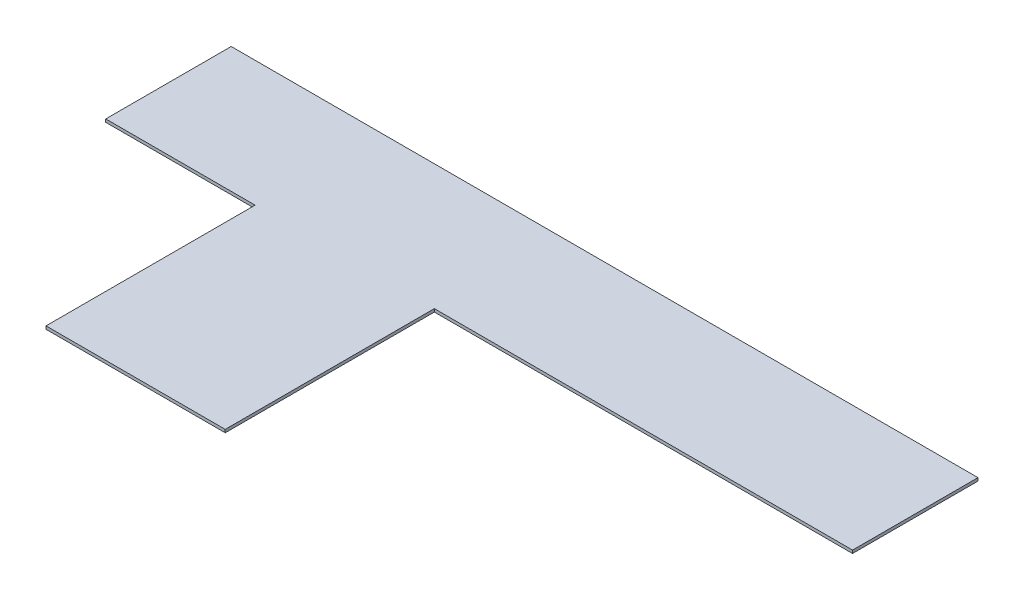
ISO-10303-21;
HEADER;
FILE_DESCRIPTION(('STEP AP214'),'2;1');
FILE_NAME('part.step','',(''),(''),'','','');
FILE_SCHEMA(('AUTOMOTIVE_DESIGN { 1 0 10303 214 1 1 1 1 }'));
ENDSEC;
DATA;
#1=APPLICATION_CONTEXT('core data for automotive mechanical design processes');
#2=APPLICATION_PROTOCOL_DEFINITION('international standard','automotive_design',2000,#1);
#3=PRODUCT_CONTEXT('',#1,'mechanical');
#4=PRODUCT('Part','Part','',(#3));
#5=PRODUCT_RELATED_PRODUCT_CATEGORY('part','',(#4));
#6=PRODUCT_DEFINITION_FORMATION('','',#4);
#7=PRODUCT_DEFINITION_CONTEXT('part definition',#1,'design');
#8=PRODUCT_DEFINITION('design','',#6,#7);
#9=PRODUCT_DEFINITION_SHAPE('','',#8);
#10=(LENGTH_UNIT() NAMED_UNIT(*) SI_UNIT(.MILLI.,.METRE.));
#11=(NAMED_UNIT(*) PLANE_ANGLE_UNIT() SI_UNIT($,.RADIAN.));
#12=(NAMED_UNIT(*) SI_UNIT($,.STERADIAN.) SOLID_ANGLE_UNIT());
#13=UNCERTAINTY_MEASURE_WITH_UNIT(LENGTH_MEASURE(1.E-05),#10,'distance_accuracy_value','');
#14=(GEOMETRIC_REPRESENTATION_CONTEXT(3) GLOBAL_UNCERTAINTY_ASSIGNED_CONTEXT((#13)) GLOBAL_UNIT_ASSIGNED_CONTEXT((#10,
#11,#12)) REPRESENTATION_CONTEXT('',''));
#15=CARTESIAN_POINT('',(0.,0.,0.));
#16=DIRECTION('',(0.,0.,1.));
#17=DIRECTION('',(1.,0.,0.));
#18=AXIS2_PLACEMENT_3D('',#15,#16,#17);
#19=CARTESIAN_POINT('',(6088.0829015544,50.,0.));
#20=DIRECTION('',(1.,0.,0.));
#21=DIRECTION('',(0.,0.,-1.));
#22=AXIS2_PLACEMENT_3D('',#19,#20,#21);
#23=PLANE('',#22);
#24=DIRECTION('',(0.,0.,1.));
#25=VECTOR('',#24,1.);
#26=CARTESIAN_POINT('',(6088.0829015544,0.,0.));
#27=LINE('',#26,#25);
#28=CARTESIAN_POINT('',(6088.0829015544,0.,-2389.89637305699));
#29=VERTEX_POINT('',#28);
#30=CARTESIAN_POINT('',(6088.0829015544,0.,-289.896373056994));
#31=VERTEX_POINT('',#30);
#32=EDGE_CURVE('E230',#29,#31,#27,.T.);
#33=ORIENTED_EDGE('',*,*,#32,.F.);
#34=DIRECTION('',(0.,-1.,0.));
#35=VECTOR('',#34,1.);
#36=CARTESIAN_POINT('',(6088.0829015544,50.,-2389.89637305699));
#37=LINE('',#36,#35);
#38=CARTESIAN_POINT('',(6088.0829015544,50.,-2389.89637305699));
#39=VERTEX_POINT('',#38);
#40=EDGE_CURVE('E11',#39,#29,#37,.T.);
#41=ORIENTED_EDGE('',*,*,#40,.F.);
#42=DIRECTION('',(0.,0.,1.));
#43=VECTOR('',#42,1.);
#44=CARTESIAN_POINT('',(6088.0829015544,50.,0.));
#45=LINE('',#44,#43);
#46=CARTESIAN_POINT('',(6088.0829015544,50.,-289.896373056994));
#47=VERTEX_POINT('',#46);
#48=EDGE_CURVE('E327',#39,#47,#45,.T.);
#49=ORIENTED_EDGE('',*,*,#48,.T.);
#50=DIRECTION('',(0.,-1.,0.));
#51=VECTOR('',#50,1.);
#52=CARTESIAN_POINT('',(6088.0829015544,50.,-289.896373056994));
#53=LINE('',#52,#51);
#54=EDGE_CURVE('E363',#47,#31,#53,.T.);
#55=ORIENTED_EDGE('',*,*,#54,.T.);
#56=EDGE_LOOP('',(#33,#41,#49,#55));
#57=FACE_BOUND('',#56,.T.);
#58=ADVANCED_FACE('F35',(#57),#23,.T.);
#59=CARTESIAN_POINT('',(0.,50.,-2389.89637305699));
#60=DIRECTION('',(0.,0.,-1.));
#61=DIRECTION('',(-1.,0.,0.));
#62=AXIS2_PLACEMENT_3D('',#59,#60,#61);
#63=PLANE('',#62);
#64=DIRECTION('',(1.,0.,0.));
#65=VECTOR('',#64,1.);
#66=CARTESIAN_POINT('',(0.,0.,-2389.89637305699));
#67=LINE('',#66,#65);
#68=CARTESIAN_POINT('',(-6411.9170984456,0.,-2389.89637305699));
#69=VERTEX_POINT('',#68);
#70=EDGE_CURVE('E348',#69,#29,#67,.T.);
#71=ORIENTED_EDGE('',*,*,#70,.F.);
#72=DIRECTION('',(0.,-1.,0.));
#73=VECTOR('',#72,1.);
#74=CARTESIAN_POINT('',(-6411.9170984456,50.,-2389.89637305699));
#75=LINE('',#74,#73);
#76=CARTESIAN_POINT('',(-6411.9170984456,50.,-2389.89637305699));
#77=VERTEX_POINT('',#76);
#78=EDGE_CURVE('E42',#77,#69,#75,.T.);
#79=ORIENTED_EDGE('',*,*,#78,.F.);
#80=DIRECTION('',(1.,0.,0.));
#81=VECTOR('',#80,1.);
#82=CARTESIAN_POINT('',(0.,50.,-2389.89637305699));
#83=LINE('',#82,#81);
#84=EDGE_CURVE('E330',#77,#39,#83,.T.);
#85=ORIENTED_EDGE('',*,*,#84,.T.);
#86=ORIENTED_EDGE('',*,*,#40,.T.);
#87=EDGE_LOOP('',(#71,#79,#85,#86));
#88=FACE_BOUND('',#87,.T.);
#89=ADVANCED_FACE('F389',(#88),#63,.T.);
#90=CARTESIAN_POINT('',(-6411.9170984456,50.,-2.71186971225982E-12));
#91=DIRECTION('',(1.,0.,0.));
#92=DIRECTION('',(0.,0.,-1.));
#93=AXIS2_PLACEMENT_3D('',#90,#91,#92);
#94=PLANE('',#93);
#95=DIRECTION('',(0.,0.,1.));
#96=VECTOR('',#95,1.);
#97=CARTESIAN_POINT('',(-6411.9170984456,0.,-2.71186971225982E-12));
#98=LINE('',#97,#96);
#99=CARTESIAN_POINT('',(-6411.9170984456,0.,-289.896373056994));
#100=VERTEX_POINT('',#99);
#101=EDGE_CURVE('E351',#69,#100,#98,.T.);
#102=ORIENTED_EDGE('',*,*,#101,.T.);
#103=DIRECTION('',(0.,-1.,0.));
#104=VECTOR('',#103,1.);
#105=CARTESIAN_POINT('',(-6411.9170984456,50.,-289.896373056994));
#106=LINE('',#105,#104);
#107=CARTESIAN_POINT('',(-6411.9170984456,50.,-289.896373056994));
#108=VERTEX_POINT('',#107);
#109=EDGE_CURVE('E375',#108,#100,#106,.T.);
#110=ORIENTED_EDGE('',*,*,#109,.F.);
#111=DIRECTION('',(0.,0.,1.));
#112=VECTOR('',#111,1.);
#113=CARTESIAN_POINT('',(-6411.9170984456,50.,-2.71186971225982E-12));
#114=LINE('',#113,#112);
#115=EDGE_CURVE('E334',#77,#108,#114,.T.);
#116=ORIENTED_EDGE('',*,*,#115,.F.);
#117=ORIENTED_EDGE('',*,*,#78,.T.);
#118=EDGE_LOOP('',(#102,#110,#116,#117));
#119=FACE_BOUND('',#118,.T.);
#120=ADVANCED_FACE('F380',(#119),#94,.F.);
#121=CARTESIAN_POINT('',(0.,50.,-289.896373056994));
#122=DIRECTION('',(0.,0.,-1.));
#123=DIRECTION('',(-1.,0.,0.));
#124=AXIS2_PLACEMENT_3D('',#121,#122,#123);
#125=PLANE('',#124);
#126=DIRECTION('',(1.,0.,0.));
#127=VECTOR('',#126,1.);
#128=CARTESIAN_POINT('',(0.,0.,-289.896373056994));
#129=LINE('',#128,#127);
#130=CARTESIAN_POINT('',(-3911.9170984456,0.,-289.896373056994));
#131=VERTEX_POINT('',#130);
#132=EDGE_CURVE('E353',#100,#131,#129,.T.);
#133=ORIENTED_EDGE('',*,*,#132,.T.);
#134=DIRECTION('',(0.,-1.,0.));
#135=VECTOR('',#134,1.);
#136=CARTESIAN_POINT('',(-3911.9170984456,50.,-289.896373056994));
#137=LINE('',#136,#135);
#138=CARTESIAN_POINT('',(-3911.9170984456,50.,-289.896373056994));
#139=VERTEX_POINT('',#138);
#140=EDGE_CURVE('E372',#139,#131,#137,.T.);
#141=ORIENTED_EDGE('',*,*,#140,.F.);
#142=DIRECTION('',(1.,0.,0.));
#143=VECTOR('',#142,1.);
#144=CARTESIAN_POINT('',(0.,50.,-289.896373056994));
#145=LINE('',#144,#143);
#146=EDGE_CURVE('E336',#108,#139,#145,.T.);
#147=ORIENTED_EDGE('',*,*,#146,.F.);
#148=ORIENTED_EDGE('',*,*,#109,.T.);
#149=EDGE_LOOP('',(#133,#141,#147,#148));
#150=FACE_BOUND('',#149,.T.);
#151=ADVANCED_FACE('F414',(#150),#125,.F.);
#152=CARTESIAN_POINT('',(-3911.9170984456,50.,9.92708670427231E-13));
#153=DIRECTION('',(1.,0.,0.));
#154=DIRECTION('',(0.,0.,-1.));
#155=AXIS2_PLACEMENT_3D('',#152,#153,#154);
#156=PLANE('',#155);
#157=DIRECTION('',(0.,0.,1.));
#158=VECTOR('',#157,1.);
#159=CARTESIAN_POINT('',(-3911.9170984456,0.,9.92708670427231E-13));
#160=LINE('',#159,#158);
#161=CARTESIAN_POINT('',(-3911.91709844559,0.,3210.10362694301));
#162=VERTEX_POINT('',#161);
#163=EDGE_CURVE('E355',#131,#162,#160,.T.);
#164=ORIENTED_EDGE('',*,*,#163,.T.);
#165=DIRECTION('',(0.,-1.,0.));
#166=VECTOR('',#165,1.);
#167=CARTESIAN_POINT('',(-3911.91709844559,50.,3210.10362694301));
#168=LINE('',#167,#166);
#169=CARTESIAN_POINT('',(-3911.91709844559,50.,3210.10362694301));
#170=VERTEX_POINT('',#169);
#171=EDGE_CURVE('E369',#170,#162,#168,.T.);
#172=ORIENTED_EDGE('',*,*,#171,.F.);
#173=DIRECTION('',(0.,0.,1.));
#174=VECTOR('',#173,1.);
#175=CARTESIAN_POINT('',(-3911.9170984456,50.,9.92708670427231E-13));
#176=LINE('',#175,#174);
#177=EDGE_CURVE('E338',#139,#170,#176,.T.);
#178=ORIENTED_EDGE('',*,*,#177,.F.);
#179=ORIENTED_EDGE('',*,*,#140,.T.);
#180=EDGE_LOOP('',(#164,#172,#178,#179));
#181=FACE_BOUND('',#180,.T.);
#182=ADVANCED_FACE('F409',(#181),#156,.F.);
#183=CARTESIAN_POINT('',(0.,50.,3210.10362694301));
#184=DIRECTION('',(0.,0.,-1.));
#185=DIRECTION('',(-1.,0.,0.));
#186=AXIS2_PLACEMENT_3D('',#183,#184,#185);
#187=PLANE('',#186);
#188=DIRECTION('',(1.,0.,0.));
#189=VECTOR('',#188,1.);
#190=CARTESIAN_POINT('',(0.,0.,3210.10362694301));
#191=LINE('',#190,#189);
#192=CARTESIAN_POINT('',(-911.917098445595,0.,3210.10362694301));
#193=VERTEX_POINT('',#192);
#194=EDGE_CURVE('E357',#162,#193,#191,.T.);
#195=ORIENTED_EDGE('',*,*,#194,.T.);
#196=DIRECTION('',(0.,-1.,0.));
#197=VECTOR('',#196,1.);
#198=CARTESIAN_POINT('',(-911.917098445595,50.,3210.10362694301));
#199=LINE('',#198,#197);
#200=CARTESIAN_POINT('',(-911.917098445595,50.,3210.10362694301));
#201=VERTEX_POINT('',#200);
#202=EDGE_CURVE('E367',#201,#193,#199,.T.);
#203=ORIENTED_EDGE('',*,*,#202,.F.);
#204=DIRECTION('',(1.,0.,0.));
#205=VECTOR('',#204,1.);
#206=CARTESIAN_POINT('',(0.,50.,3210.10362694301));
#207=LINE('',#206,#205);
#208=EDGE_CURVE('E341',#170,#201,#207,.T.);
#209=ORIENTED_EDGE('',*,*,#208,.F.);
#210=ORIENTED_EDGE('',*,*,#171,.T.);
#211=EDGE_LOOP('',(#195,#203,#209,#210));
#212=FACE_BOUND('',#211,.T.);
#213=ADVANCED_FACE('F406',(#212),#187,.F.);
#214=CARTESIAN_POINT('',(-911.917098445595,50.,0.));
#215=DIRECTION('',(1.,0.,0.));
#216=DIRECTION('',(0.,0.,-1.));
#217=AXIS2_PLACEMENT_3D('',#214,#215,#216);
#218=PLANE('',#217);
#219=DIRECTION('',(0.,0.,1.));
#220=VECTOR('',#219,1.);
#221=CARTESIAN_POINT('',(-911.917098445595,0.,0.));
#222=LINE('',#221,#220);
#223=CARTESIAN_POINT('',(-911.917098445595,0.,-289.896373056994));
#224=VERTEX_POINT('',#223);
#225=EDGE_CURVE('E360',#224,#193,#222,.T.);
#226=ORIENTED_EDGE('',*,*,#225,.F.);
#227=DIRECTION('',(0.,-1.,0.));
#228=VECTOR('',#227,1.);
#229=CARTESIAN_POINT('',(-911.917098445595,50.,-289.896373056994));
#230=LINE('',#229,#228);
#231=CARTESIAN_POINT('',(-911.917098445595,50.,-289.896373056994));
#232=VERTEX_POINT('',#231);
#233=EDGE_CURVE('E365',#232,#224,#230,.T.);
#234=ORIENTED_EDGE('',*,*,#233,.F.);
#235=DIRECTION('',(0.,0.,1.));
#236=VECTOR('',#235,1.);
#237=CARTESIAN_POINT('',(-911.917098445595,50.,0.));
#238=LINE('',#237,#236);
#239=EDGE_CURVE('E343',#232,#201,#238,.T.);
#240=ORIENTED_EDGE('',*,*,#239,.T.);
#241=ORIENTED_EDGE('',*,*,#202,.T.);
#242=EDGE_LOOP('',(#226,#234,#240,#241));
#243=FACE_BOUND('',#242,.T.);
#244=ADVANCED_FACE('F400',(#243),#218,.T.);
#245=EDGE_CURVE('E331',#224,#31,#129,.T.);
#246=ORIENTED_EDGE('',*,*,#245,.T.);
#247=ORIENTED_EDGE('',*,*,#54,.F.);
#248=EDGE_CURVE('E339',#232,#47,#145,.T.);
#249=ORIENTED_EDGE('',*,*,#248,.F.);
#250=ORIENTED_EDGE('',*,*,#233,.T.);
#251=EDGE_LOOP('',(#246,#247,#249,#250));
#252=FACE_BOUND('',#251,.T.);
#253=ADVANCED_FACE('F417',(#252),#125,.F.);
#254=CARTESIAN_POINT('',(0.,50.,0.));
#255=DIRECTION('',(0.,1.,0.));
#256=DIRECTION('',(0.,0.,1.));
#257=AXIS2_PLACEMENT_3D('',#254,#255,#256);
#258=PLANE('',#257);
#259=ORIENTED_EDGE('',*,*,#48,.F.);
#260=ORIENTED_EDGE('',*,*,#84,.F.);
#261=ORIENTED_EDGE('',*,*,#115,.T.);
#262=ORIENTED_EDGE('',*,*,#146,.T.);
#263=ORIENTED_EDGE('',*,*,#177,.T.);
#264=ORIENTED_EDGE('',*,*,#208,.T.);
#265=ORIENTED_EDGE('',*,*,#239,.F.);
#266=ORIENTED_EDGE('',*,*,#248,.T.);
#267=EDGE_LOOP('',(#259,#260,#261,#262,#263,#264,#265,#266));
#268=FACE_BOUND('',#267,.T.);
#269=ADVANCED_FACE('F416',(#268),#258,.T.);
#270=CARTESIAN_POINT('',(0.,0.,0.));
#271=DIRECTION('',(0.,1.,0.));
#272=DIRECTION('',(0.,0.,1.));
#273=AXIS2_PLACEMENT_3D('',#270,#271,#272);
#274=PLANE('',#273);
#275=DIRECTION('',(1.,0.,0.));
#276=VECTOR('',#275,1.);
#277=CARTESIAN_POINT('',(-2036.9170984456,0.,1085.10362694301));
#278=LINE('',#277,#276);
#279=CARTESIAN_POINT('',(-2786.9170984456,0.,1085.10362694301));
#280=VERTEX_POINT('',#279);
#281=CARTESIAN_POINT('',(-2036.9170984456,0.,1085.10362694301));
#282=VERTEX_POINT('',#281);
#283=EDGE_CURVE('E223',#280,#282,#278,.T.);
#284=ORIENTED_EDGE('',*,*,#283,.F.);
#285=DIRECTION('',(0.,0.,-1.));
#286=VECTOR('',#285,1.);
#287=CARTESIAN_POINT('',(-2786.9170984456,0.,1085.10362694301));
#288=LINE('',#287,#286);
#289=CARTESIAN_POINT('',(-2786.9170984456,0.,1835.10362694301));
#290=VERTEX_POINT('',#289);
#291=EDGE_CURVE('E49',#290,#280,#288,.T.);
#292=ORIENTED_EDGE('',*,*,#291,.F.);
#293=DIRECTION('',(-1.,0.,0.));
#294=VECTOR('',#293,1.);
#295=CARTESIAN_POINT('',(-2036.9170984456,0.,1835.10362694301));
#296=LINE('',#295,#294);
#297=CARTESIAN_POINT('',(-2036.9170984456,0.,1835.10362694301));
#298=VERTEX_POINT('',#297);
#299=EDGE_CURVE('E214',#298,#290,#296,.T.);
#300=ORIENTED_EDGE('',*,*,#299,.F.);
#301=DIRECTION('',(0.,0.,1.));
#302=VECTOR('',#301,1.);
#303=CARTESIAN_POINT('',(-2036.9170984456,0.,1085.10362694301));
#304=LINE('',#303,#302);
#305=EDGE_CURVE('E217',#282,#298,#304,.T.);
#306=ORIENTED_EDGE('',*,*,#305,.F.);
#307=EDGE_LOOP('',(#284,#292,#300,#306));
#308=FACE_BOUND('',#307,.T.);
#309=DIRECTION('',(1.,0.,0.));
#310=VECTOR('',#309,1.);
#311=CARTESIAN_POINT('',(-2911.9170984456,0.,-1714.89637305699));
#312=LINE('',#311,#310);
#313=CARTESIAN_POINT('',(-3661.9170984456,0.,-1714.89637305699));
#314=VERTEX_POINT('',#313);
#315=CARTESIAN_POINT('',(-2911.9170984456,0.,-1714.89637305699));
#316=VERTEX_POINT('',#315);
#317=EDGE_CURVE('E249',#314,#316,#312,.T.);
#318=ORIENTED_EDGE('',*,*,#317,.F.);
#319=DIRECTION('',(0.,0.,-1.));
#320=VECTOR('',#319,1.);
#321=CARTESIAN_POINT('',(-3661.9170984456,0.,-1714.89637305699));
#322=LINE('',#321,#320);
#323=CARTESIAN_POINT('',(-3661.9170984456,0.,-964.896373056995));
#324=VERTEX_POINT('',#323);
#325=EDGE_CURVE('E57',#324,#314,#322,.T.);
#326=ORIENTED_EDGE('',*,*,#325,.F.);
#327=DIRECTION('',(-1.,0.,0.));
#328=VECTOR('',#327,1.);
#329=CARTESIAN_POINT('',(-2911.9170984456,0.,-964.896373056994));
#330=LINE('',#329,#328);
#331=CARTESIAN_POINT('',(-2911.9170984456,0.,-964.896373056994));
#332=VERTEX_POINT('',#331);
#333=EDGE_CURVE('E238',#332,#324,#330,.T.);
#334=ORIENTED_EDGE('',*,*,#333,.F.);
#335=DIRECTION('',(0.,0.,1.));
#336=VECTOR('',#335,1.);
#337=CARTESIAN_POINT('',(-2911.9170984456,0.,-1714.89637305699));
#338=LINE('',#337,#336);
#339=EDGE_CURVE('E253',#316,#332,#338,.T.);
#340=ORIENTED_EDGE('',*,*,#339,.F.);
#341=EDGE_LOOP('',(#318,#326,#334,#340));
#342=FACE_BOUND('',#341,.T.);
#343=DIRECTION('',(1.,0.,0.));
#344=VECTOR('',#343,1.);
#345=CARTESIAN_POINT('',(213.082901554404,0.,-1714.89637305699));
#346=LINE('',#345,#344);
#347=CARTESIAN_POINT('',(-536.917098445596,0.,-1714.89637305699));
#348=VERTEX_POINT('',#347);
#349=CARTESIAN_POINT('',(213.082901554404,0.,-1714.89637305699));
#350=VERTEX_POINT('',#349);
#351=EDGE_CURVE('E280',#348,#350,#346,.T.);
#352=ORIENTED_EDGE('',*,*,#351,.F.);
#353=DIRECTION('',(0.,0.,-1.));
#354=VECTOR('',#353,1.);
#355=CARTESIAN_POINT('',(-536.917098445596,0.,-1714.89637305699));
#356=LINE('',#355,#354);
#357=CARTESIAN_POINT('',(-536.917098445596,0.,-964.896373056994));
#358=VERTEX_POINT('',#357);
#359=EDGE_CURVE('E278',#358,#348,#356,.T.);
#360=ORIENTED_EDGE('',*,*,#359,.F.);
#361=DIRECTION('',(-1.,0.,0.));
#362=VECTOR('',#361,1.);
#363=CARTESIAN_POINT('',(213.082901554404,0.,-964.896373056994));
#364=LINE('',#363,#362);
#365=CARTESIAN_POINT('',(213.082901554404,0.,-964.896373056994));
#366=VERTEX_POINT('',#365);
#367=EDGE_CURVE('E268',#366,#358,#364,.T.);
#368=ORIENTED_EDGE('',*,*,#367,.F.);
#369=DIRECTION('',(0.,0.,1.));
#370=VECTOR('',#369,1.);
#371=CARTESIAN_POINT('',(213.082901554404,0.,-1714.89637305699));
#372=LINE('',#371,#370);
#373=EDGE_CURVE('E284',#350,#366,#372,.T.);
#374=ORIENTED_EDGE('',*,*,#373,.F.);
#375=EDGE_LOOP('',(#352,#360,#368,#374));
#376=FACE_BOUND('',#375,.T.);
#377=DIRECTION('',(1.,0.,0.));
#378=VECTOR('',#377,1.);
#379=CARTESIAN_POINT('',(3338.0829015544,0.,-1714.89637305699));
#380=LINE('',#379,#378);
#381=CARTESIAN_POINT('',(2588.0829015544,0.,-1714.89637305699));
#382=VERTEX_POINT('',#381);
#383=CARTESIAN_POINT('',(3338.0829015544,0.,-1714.89637305699));
#384=VERTEX_POINT('',#383);
#385=EDGE_CURVE('E312',#382,#384,#380,.T.);
#386=ORIENTED_EDGE('',*,*,#385,.F.);
#387=DIRECTION('',(0.,0.,-1.));
#388=VECTOR('',#387,1.);
#389=CARTESIAN_POINT('',(2588.0829015544,0.,-1714.89637305699));
#390=LINE('',#389,#388);
#391=CARTESIAN_POINT('',(2588.0829015544,0.,-964.896373056995));
#392=VERTEX_POINT('',#391);
#393=EDGE_CURVE('E310',#392,#382,#390,.T.);
#394=ORIENTED_EDGE('',*,*,#393,.F.);
#395=DIRECTION('',(-1.,0.,0.));
#396=VECTOR('',#395,1.);
#397=CARTESIAN_POINT('',(3338.0829015544,0.,-964.896373056994));
#398=LINE('',#397,#396);
#399=CARTESIAN_POINT('',(3338.0829015544,0.,-964.896373056994));
#400=VERTEX_POINT('',#399);
#401=EDGE_CURVE('E300',#400,#392,#398,.T.);
#402=ORIENTED_EDGE('',*,*,#401,.F.);
#403=DIRECTION('',(0.,0.,1.));
#404=VECTOR('',#403,1.);
#405=CARTESIAN_POINT('',(3338.0829015544,0.,-1714.89637305699));
#406=LINE('',#405,#404);
#407=EDGE_CURVE('E315',#384,#400,#406,.T.);
#408=ORIENTED_EDGE('',*,*,#407,.F.);
#409=EDGE_LOOP('',(#386,#394,#402,#408));
#410=FACE_BOUND('',#409,.T.);
#411=ORIENTED_EDGE('',*,*,#32,.T.);
#412=ORIENTED_EDGE('',*,*,#245,.F.);
#413=ORIENTED_EDGE('',*,*,#225,.T.);
#414=ORIENTED_EDGE('',*,*,#194,.F.);
#415=ORIENTED_EDGE('',*,*,#163,.F.);
#416=ORIENTED_EDGE('',*,*,#132,.F.);
#417=ORIENTED_EDGE('',*,*,#101,.F.);
#418=ORIENTED_EDGE('',*,*,#70,.T.);
#419=EDGE_LOOP('',(#411,#412,#413,#414,#415,#416,#417,#418));
#420=FACE_BOUND('',#419,.T.);
#421=ADVANCED_FACE('F387',(#308,#342,#376,#410,#420),#274,.F.);
#422=CARTESIAN_POINT('',(2588.0829015544,10.,-1714.89637305699));
#423=DIRECTION('',(-1.,0.,0.));
#424=DIRECTION('',(0.,0.,1.));
#425=AXIS2_PLACEMENT_3D('',#422,#423,#424);
#426=PLANE('',#425);
#427=ORIENTED_EDGE('',*,*,#393,.T.);
#428=DIRECTION('',(0.,-1.,0.));
#429=VECTOR('',#428,1.);
#430=CARTESIAN_POINT('',(2588.0829015544,10.,-1714.89637305699));
#431=LINE('',#430,#429);
#432=CARTESIAN_POINT('',(2588.0829015544,10.,-1714.89637305699));
#433=VERTEX_POINT('',#432);
#434=EDGE_CURVE('E309',#433,#382,#431,.T.);
#435=ORIENTED_EDGE('',*,*,#434,.F.);
#436=DIRECTION('',(0.,0.,-1.));
#437=VECTOR('',#436,1.);
#438=CARTESIAN_POINT('',(2588.0829015544,10.,-1714.89637305699));
#439=LINE('',#438,#437);
#440=CARTESIAN_POINT('',(2588.0829015544,10.,-964.896373056995));
#441=VERTEX_POINT('',#440);
#442=EDGE_CURVE('E296',#441,#433,#439,.T.);
#443=ORIENTED_EDGE('',*,*,#442,.F.);
#444=DIRECTION('',(0.,-1.,0.));
#445=VECTOR('',#444,1.);
#446=CARTESIAN_POINT('',(2588.0829015544,10.,-964.896373056995));
#447=LINE('',#446,#445);
#448=EDGE_CURVE('E281',#441,#392,#447,.T.);
#449=ORIENTED_EDGE('',*,*,#448,.T.);
#450=EDGE_LOOP('',(#427,#435,#443,#449));
#451=FACE_BOUND('',#450,.T.);
#452=ADVANCED_FACE('F470',(#451),#426,.F.);
#453=CARTESIAN_POINT('',(3338.0829015544,10.,-964.896373056994));
#454=DIRECTION('',(0.,0.,1.));
#455=DIRECTION('',(1.,0.,0.));
#456=AXIS2_PLACEMENT_3D('',#453,#454,#455);
#457=PLANE('',#456);
#458=ORIENTED_EDGE('',*,*,#401,.T.);
#459=ORIENTED_EDGE('',*,*,#448,.F.);
#460=DIRECTION('',(-1.,0.,0.));
#461=VECTOR('',#460,1.);
#462=CARTESIAN_POINT('',(3338.0829015544,10.,-964.896373056994));
#463=LINE('',#462,#461);
#464=CARTESIAN_POINT('',(3338.0829015544,10.,-964.896373056994));
#465=VERTEX_POINT('',#464);
#466=EDGE_CURVE('E306',#465,#441,#463,.T.);
#467=ORIENTED_EDGE('',*,*,#466,.F.);
#468=DIRECTION('',(0.,-1.,0.));
#469=VECTOR('',#468,1.);
#470=CARTESIAN_POINT('',(3338.0829015544,10.,-964.896373056994));
#471=LINE('',#470,#469);
#472=EDGE_CURVE('E321',#465,#400,#471,.T.);
#473=ORIENTED_EDGE('',*,*,#472,.T.);
#474=EDGE_LOOP('',(#458,#459,#467,#473));
#475=FACE_BOUND('',#474,.T.);
#476=ADVANCED_FACE('F479',(#475),#457,.F.);
#477=CARTESIAN_POINT('',(3338.0829015544,10.,-1714.89637305699));
#478=DIRECTION('',(1.,0.,0.));
#479=DIRECTION('',(0.,0.,-1.));
#480=AXIS2_PLACEMENT_3D('',#477,#478,#479);
#481=PLANE('',#480);
#482=ORIENTED_EDGE('',*,*,#407,.T.);
#483=ORIENTED_EDGE('',*,*,#472,.F.);
#484=DIRECTION('',(0.,0.,1.));
#485=VECTOR('',#484,1.);
#486=CARTESIAN_POINT('',(3338.0829015544,10.,-1714.89637305699));
#487=LINE('',#486,#485);
#488=CARTESIAN_POINT('',(3338.0829015544,10.,-1714.89637305699));
#489=VERTEX_POINT('',#488);
#490=EDGE_CURVE('E303',#489,#465,#487,.T.);
#491=ORIENTED_EDGE('',*,*,#490,.F.);
#492=DIRECTION('',(0.,-1.,0.));
#493=VECTOR('',#492,1.);
#494=CARTESIAN_POINT('',(3338.0829015544,10.,-1714.89637305699));
#495=LINE('',#494,#493);
#496=EDGE_CURVE('E323',#489,#384,#495,.T.);
#497=ORIENTED_EDGE('',*,*,#496,.T.);
#498=EDGE_LOOP('',(#482,#483,#491,#497));
#499=FACE_BOUND('',#498,.T.);
#500=ADVANCED_FACE('F489',(#499),#481,.F.);
#501=CARTESIAN_POINT('',(3338.0829015544,10.,-1714.89637305699));
#502=DIRECTION('',(0.,0.,-1.));
#503=DIRECTION('',(-1.,0.,0.));
#504=AXIS2_PLACEMENT_3D('',#501,#502,#503);
#505=PLANE('',#504);
#506=ORIENTED_EDGE('',*,*,#385,.T.);
#507=ORIENTED_EDGE('',*,*,#496,.F.);
#508=DIRECTION('',(1.,0.,0.));
#509=VECTOR('',#508,1.);
#510=CARTESIAN_POINT('',(3338.0829015544,10.,-1714.89637305699));
#511=LINE('',#510,#509);
#512=EDGE_CURVE('E299',#433,#489,#511,.T.);
#513=ORIENTED_EDGE('',*,*,#512,.F.);
#514=ORIENTED_EDGE('',*,*,#434,.T.);
#515=EDGE_LOOP('',(#506,#507,#513,#514));
#516=FACE_BOUND('',#515,.T.);
#517=ADVANCED_FACE('F499',(#516),#505,.F.);
#518=CARTESIAN_POINT('',(0.,10.,0.));
#519=DIRECTION('',(0.,-1.,0.));
#520=DIRECTION('',(0.,0.,-1.));
#521=AXIS2_PLACEMENT_3D('',#518,#519,#520);
#522=PLANE('',#521);
#523=ORIENTED_EDGE('',*,*,#442,.T.);
#524=ORIENTED_EDGE('',*,*,#512,.T.);
#525=ORIENTED_EDGE('',*,*,#490,.T.);
#526=ORIENTED_EDGE('',*,*,#466,.T.);
#527=EDGE_LOOP('',(#523,#524,#525,#526));
#528=FACE_BOUND('',#527,.T.);
#529=ADVANCED_FACE('F509',(#528),#522,.T.);
#530=CARTESIAN_POINT('',(-536.917098445596,10.,-1714.89637305699));
#531=DIRECTION('',(-1.,0.,0.));
#532=DIRECTION('',(0.,0.,1.));
#533=AXIS2_PLACEMENT_3D('',#530,#531,#532);
#534=PLANE('',#533);
#535=ORIENTED_EDGE('',*,*,#359,.T.);
#536=DIRECTION('',(0.,-1.,0.));
#537=VECTOR('',#536,1.);
#538=CARTESIAN_POINT('',(-536.917098445596,10.,-1714.89637305699));
#539=LINE('',#538,#537);
#540=CARTESIAN_POINT('',(-536.917098445596,10.,-1714.89637305699));
#541=VERTEX_POINT('',#540);
#542=EDGE_CURVE('E277',#541,#348,#539,.T.);
#543=ORIENTED_EDGE('',*,*,#542,.F.);
#544=DIRECTION('',(0.,0.,-1.));
#545=VECTOR('',#544,1.);
#546=CARTESIAN_POINT('',(-536.917098445596,10.,-1714.89637305699));
#547=LINE('',#546,#545);
#548=CARTESIAN_POINT('',(-536.917098445596,10.,-964.896373056994));
#549=VERTEX_POINT('',#548);
#550=EDGE_CURVE('E264',#549,#541,#547,.T.);
#551=ORIENTED_EDGE('',*,*,#550,.F.);
#552=DIRECTION('',(0.,-1.,0.));
#553=VECTOR('',#552,1.);
#554=CARTESIAN_POINT('',(-536.917098445596,10.,-964.896373056994));
#555=LINE('',#554,#553);
#556=EDGE_CURVE('E250',#549,#358,#555,.T.);
#557=ORIENTED_EDGE('',*,*,#556,.T.);
#558=EDGE_LOOP('',(#535,#543,#551,#557));
#559=FACE_BOUND('',#558,.T.);
#560=ADVANCED_FACE('F519',(#559),#534,.F.);
#561=CARTESIAN_POINT('',(213.082901554404,10.,-964.896373056994));
#562=DIRECTION('',(0.,0.,1.));
#563=DIRECTION('',(1.,0.,0.));
#564=AXIS2_PLACEMENT_3D('',#561,#562,#563);
#565=PLANE('',#564);
#566=ORIENTED_EDGE('',*,*,#367,.T.);
#567=ORIENTED_EDGE('',*,*,#556,.F.);
#568=DIRECTION('',(-1.,0.,0.));
#569=VECTOR('',#568,1.);
#570=CARTESIAN_POINT('',(213.082901554404,10.,-964.896373056994));
#571=LINE('',#570,#569);
#572=CARTESIAN_POINT('',(213.082901554404,10.,-964.896373056994));
#573=VERTEX_POINT('',#572);
#574=EDGE_CURVE('E274',#573,#549,#571,.T.);
#575=ORIENTED_EDGE('',*,*,#574,.F.);
#576=DIRECTION('',(0.,-1.,0.));
#577=VECTOR('',#576,1.);
#578=CARTESIAN_POINT('',(213.082901554404,10.,-964.896373056994));
#579=LINE('',#578,#577);
#580=EDGE_CURVE('E290',#573,#366,#579,.T.);
#581=ORIENTED_EDGE('',*,*,#580,.T.);
#582=EDGE_LOOP('',(#566,#567,#575,#581));
#583=FACE_BOUND('',#582,.T.);
#584=ADVANCED_FACE('F529',(#583),#565,.F.);
#585=CARTESIAN_POINT('',(213.082901554404,10.,-1714.89637305699));
#586=DIRECTION('',(1.,0.,0.));
#587=DIRECTION('',(0.,0.,-1.));
#588=AXIS2_PLACEMENT_3D('',#585,#586,#587);
#589=PLANE('',#588);
#590=ORIENTED_EDGE('',*,*,#373,.T.);
#591=ORIENTED_EDGE('',*,*,#580,.F.);
#592=DIRECTION('',(0.,0.,1.));
#593=VECTOR('',#592,1.);
#594=CARTESIAN_POINT('',(213.082901554404,10.,-1714.89637305699));
#595=LINE('',#594,#593);
#596=CARTESIAN_POINT('',(213.082901554404,10.,-1714.89637305699));
#597=VERTEX_POINT('',#596);
#598=EDGE_CURVE('E271',#597,#573,#595,.T.);
#599=ORIENTED_EDGE('',*,*,#598,.F.);
#600=DIRECTION('',(0.,-1.,0.));
#601=VECTOR('',#600,1.);
#602=CARTESIAN_POINT('',(213.082901554404,10.,-1714.89637305699));
#603=LINE('',#602,#601);
#604=EDGE_CURVE('E292',#597,#350,#603,.T.);
#605=ORIENTED_EDGE('',*,*,#604,.T.);
#606=EDGE_LOOP('',(#590,#591,#599,#605));
#607=FACE_BOUND('',#606,.T.);
#608=ADVANCED_FACE('F539',(#607),#589,.F.);
#609=CARTESIAN_POINT('',(213.082901554404,10.,-1714.89637305699));
#610=DIRECTION('',(0.,0.,-1.));
#611=DIRECTION('',(-1.,0.,0.));
#612=AXIS2_PLACEMENT_3D('',#609,#610,#611);
#613=PLANE('',#612);
#614=ORIENTED_EDGE('',*,*,#351,.T.);
#615=ORIENTED_EDGE('',*,*,#604,.F.);
#616=DIRECTION('',(1.,0.,0.));
#617=VECTOR('',#616,1.);
#618=CARTESIAN_POINT('',(213.082901554404,10.,-1714.89637305699));
#619=LINE('',#618,#617);
#620=EDGE_CURVE('E267',#541,#597,#619,.T.);
#621=ORIENTED_EDGE('',*,*,#620,.F.);
#622=ORIENTED_EDGE('',*,*,#542,.T.);
#623=EDGE_LOOP('',(#614,#615,#621,#622));
#624=FACE_BOUND('',#623,.T.);
#625=ADVANCED_FACE('F549',(#624),#613,.F.);
#626=CARTESIAN_POINT('',(0.,10.,0.));
#627=DIRECTION('',(0.,-1.,0.));
#628=DIRECTION('',(0.,0.,-1.));
#629=AXIS2_PLACEMENT_3D('',#626,#627,#628);
#630=PLANE('',#629);
#631=ORIENTED_EDGE('',*,*,#550,.T.);
#632=ORIENTED_EDGE('',*,*,#620,.T.);
#633=ORIENTED_EDGE('',*,*,#598,.T.);
#634=ORIENTED_EDGE('',*,*,#574,.T.);
#635=EDGE_LOOP('',(#631,#632,#633,#634));
#636=FACE_BOUND('',#635,.T.);
#637=ADVANCED_FACE('F559',(#636),#630,.T.);
#638=CARTESIAN_POINT('',(-3661.9170984456,10.,-1714.89637305699));
#639=DIRECTION('',(-1.,0.,0.));
#640=DIRECTION('',(0.,0.,1.));
#641=AXIS2_PLACEMENT_3D('',#638,#639,#640);
#642=PLANE('',#641);
#643=ORIENTED_EDGE('',*,*,#325,.T.);
#644=DIRECTION('',(0.,-1.,0.));
#645=VECTOR('',#644,1.);
#646=CARTESIAN_POINT('',(-3661.9170984456,10.,-1714.89637305699));
#647=LINE('',#646,#645);
#648=CARTESIAN_POINT('',(-3661.9170984456,10.,-1714.89637305699));
#649=VERTEX_POINT('',#648);
#650=EDGE_CURVE('E247',#649,#314,#647,.T.);
#651=ORIENTED_EDGE('',*,*,#650,.F.);
#652=DIRECTION('',(0.,0.,-1.));
#653=VECTOR('',#652,1.);
#654=CARTESIAN_POINT('',(-3661.9170984456,10.,-1714.89637305699));
#655=LINE('',#654,#653);
#656=CARTESIAN_POINT('',(-3661.9170984456,10.,-964.896373056995));
#657=VERTEX_POINT('',#656);
#658=EDGE_CURVE('E234',#657,#649,#655,.T.);
#659=ORIENTED_EDGE('',*,*,#658,.F.);
#660=DIRECTION('',(0.,-1.,0.));
#661=VECTOR('',#660,1.);
#662=CARTESIAN_POINT('',(-3661.9170984456,10.,-964.896373056995));
#663=LINE('',#662,#661);
#664=EDGE_CURVE('E224',#657,#324,#663,.T.);
#665=ORIENTED_EDGE('',*,*,#664,.T.);
#666=EDGE_LOOP('',(#643,#651,#659,#665));
#667=FACE_BOUND('',#666,.T.);
#668=ADVANCED_FACE('F569',(#667),#642,.F.);
#669=CARTESIAN_POINT('',(-2911.9170984456,10.,-964.896373056994));
#670=DIRECTION('',(0.,0.,1.));
#671=DIRECTION('',(1.,0.,0.));
#672=AXIS2_PLACEMENT_3D('',#669,#670,#671);
#673=PLANE('',#672);
#674=ORIENTED_EDGE('',*,*,#333,.T.);
#675=ORIENTED_EDGE('',*,*,#664,.F.);
#676=DIRECTION('',(-1.,0.,0.));
#677=VECTOR('',#676,1.);
#678=CARTESIAN_POINT('',(-2911.9170984456,10.,-964.896373056994));
#679=LINE('',#678,#677);
#680=CARTESIAN_POINT('',(-2911.9170984456,10.,-964.896373056994));
#681=VERTEX_POINT('',#680);
#682=EDGE_CURVE('E244',#681,#657,#679,.T.);
#683=ORIENTED_EDGE('',*,*,#682,.F.);
#684=DIRECTION('',(0.,-1.,0.));
#685=VECTOR('',#684,1.);
#686=CARTESIAN_POINT('',(-2911.9170984456,10.,-964.896373056994));
#687=LINE('',#686,#685);
#688=EDGE_CURVE('E259',#681,#332,#687,.T.);
#689=ORIENTED_EDGE('',*,*,#688,.T.);
#690=EDGE_LOOP('',(#674,#675,#683,#689));
#691=FACE_BOUND('',#690,.T.);
#692=ADVANCED_FACE('F579',(#691),#673,.F.);
#693=CARTESIAN_POINT('',(-2911.9170984456,10.,-1714.89637305699));
#694=DIRECTION('',(1.,0.,0.));
#695=DIRECTION('',(0.,0.,-1.));
#696=AXIS2_PLACEMENT_3D('',#693,#694,#695);
#697=PLANE('',#696);
#698=ORIENTED_EDGE('',*,*,#339,.T.);
#699=ORIENTED_EDGE('',*,*,#688,.F.);
#700=DIRECTION('',(0.,0.,1.));
#701=VECTOR('',#700,1.);
#702=CARTESIAN_POINT('',(-2911.9170984456,10.,-1714.89637305699));
#703=LINE('',#702,#701);
#704=CARTESIAN_POINT('',(-2911.9170984456,10.,-1714.89637305699));
#705=VERTEX_POINT('',#704);
#706=EDGE_CURVE('E241',#705,#681,#703,.T.);
#707=ORIENTED_EDGE('',*,*,#706,.F.);
#708=DIRECTION('',(0.,-1.,0.));
#709=VECTOR('',#708,1.);
#710=CARTESIAN_POINT('',(-2911.9170984456,10.,-1714.89637305699));
#711=LINE('',#710,#709);
#712=EDGE_CURVE('E261',#705,#316,#711,.T.);
#713=ORIENTED_EDGE('',*,*,#712,.T.);
#714=EDGE_LOOP('',(#698,#699,#707,#713));
#715=FACE_BOUND('',#714,.T.);
#716=ADVANCED_FACE('F588',(#715),#697,.F.);
#717=CARTESIAN_POINT('',(-2911.9170984456,10.,-1714.89637305699));
#718=DIRECTION('',(0.,0.,-1.));
#719=DIRECTION('',(-1.,0.,0.));
#720=AXIS2_PLACEMENT_3D('',#717,#718,#719);
#721=PLANE('',#720);
#722=ORIENTED_EDGE('',*,*,#317,.T.);
#723=ORIENTED_EDGE('',*,*,#712,.F.);
#724=DIRECTION('',(1.,0.,0.));
#725=VECTOR('',#724,1.);
#726=CARTESIAN_POINT('',(-2911.9170984456,10.,-1714.89637305699));
#727=LINE('',#726,#725);
#728=EDGE_CURVE('E237',#649,#705,#727,.T.);
#729=ORIENTED_EDGE('',*,*,#728,.F.);
#730=ORIENTED_EDGE('',*,*,#650,.T.);
#731=EDGE_LOOP('',(#722,#723,#729,#730));
#732=FACE_BOUND('',#731,.T.);
#733=ADVANCED_FACE('F598',(#732),#721,.F.);
#734=CARTESIAN_POINT('',(0.,10.,0.));
#735=DIRECTION('',(0.,-1.,0.));
#736=DIRECTION('',(0.,0.,-1.));
#737=AXIS2_PLACEMENT_3D('',#734,#735,#736);
#738=PLANE('',#737);
#739=ORIENTED_EDGE('',*,*,#658,.T.);
#740=ORIENTED_EDGE('',*,*,#728,.T.);
#741=ORIENTED_EDGE('',*,*,#706,.T.);
#742=ORIENTED_EDGE('',*,*,#682,.T.);
#743=EDGE_LOOP('',(#739,#740,#741,#742));
#744=FACE_BOUND('',#743,.T.);
#745=ADVANCED_FACE('F608',(#744),#738,.T.);
#746=CARTESIAN_POINT('',(-2786.9170984456,10.,1085.10362694301));
#747=DIRECTION('',(-1.,0.,0.));
#748=DIRECTION('',(0.,0.,1.));
#749=AXIS2_PLACEMENT_3D('',#746,#747,#748);
#750=PLANE('',#749);
#751=ORIENTED_EDGE('',*,*,#291,.T.);
#752=DIRECTION('',(0.,-1.,0.));
#753=VECTOR('',#752,1.);
#754=CARTESIAN_POINT('',(-2786.9170984456,10.,1085.10362694301));
#755=LINE('',#754,#753);
#756=CARTESIAN_POINT('',(-2786.9170984456,10.,1085.10362694301));
#757=VERTEX_POINT('',#756);
#758=EDGE_CURVE('E192',#757,#280,#755,.T.);
#759=ORIENTED_EDGE('',*,*,#758,.F.);
#760=DIRECTION('',(0.,0.,-1.));
#761=VECTOR('',#760,1.);
#762=CARTESIAN_POINT('',(-2786.9170984456,10.,1085.10362694301));
#763=LINE('',#762,#761);
#764=CARTESIAN_POINT('',(-2786.9170984456,10.,1835.10362694301));
#765=VERTEX_POINT('',#764);
#766=EDGE_CURVE('E196',#765,#757,#763,.T.);
#767=ORIENTED_EDGE('',*,*,#766,.F.);
#768=DIRECTION('',(0.,-1.,0.));
#769=VECTOR('',#768,1.);
#770=CARTESIAN_POINT('',(-2786.9170984456,10.,1835.10362694301));
#771=LINE('',#770,#769);
#772=EDGE_CURVE('E228',#765,#290,#771,.T.);
#773=ORIENTED_EDGE('',*,*,#772,.T.);
#774=EDGE_LOOP('',(#751,#759,#767,#773));
#775=FACE_BOUND('',#774,.T.);
#776=ADVANCED_FACE('F194',(#775),#750,.F.);
#777=CARTESIAN_POINT('',(-2036.9170984456,10.,1835.10362694301));
#778=DIRECTION('',(0.,0.,1.));
#779=DIRECTION('',(1.,0.,0.));
#780=AXIS2_PLACEMENT_3D('',#777,#778,#779);
#781=PLANE('',#780);
#782=ORIENTED_EDGE('',*,*,#299,.T.);
#783=ORIENTED_EDGE('',*,*,#772,.F.);
#784=DIRECTION('',(-1.,0.,0.));
#785=VECTOR('',#784,1.);
#786=CARTESIAN_POINT('',(-2036.9170984456,10.,1835.10362694301));
#787=LINE('',#786,#785);
#788=CARTESIAN_POINT('',(-2036.9170984456,10.,1835.10362694301));
#789=VERTEX_POINT('',#788);
#790=EDGE_CURVE('E202',#789,#765,#787,.T.);
#791=ORIENTED_EDGE('',*,*,#790,.F.);
#792=DIRECTION('',(0.,-1.,0.));
#793=VECTOR('',#792,1.);
#794=CARTESIAN_POINT('',(-2036.9170984456,10.,1835.10362694301));
#795=LINE('',#794,#793);
#796=EDGE_CURVE('E231',#789,#298,#795,.T.);
#797=ORIENTED_EDGE('',*,*,#796,.T.);
#798=EDGE_LOOP('',(#782,#783,#791,#797));
#799=FACE_BOUND('',#798,.T.);
#800=ADVANCED_FACE('F627',(#799),#781,.F.);
#801=CARTESIAN_POINT('',(-2036.9170984456,10.,1085.10362694301));
#802=DIRECTION('',(1.,0.,0.));
#803=DIRECTION('',(0.,0.,-1.));
#804=AXIS2_PLACEMENT_3D('',#801,#802,#803);
#805=PLANE('',#804);
#806=ORIENTED_EDGE('',*,*,#305,.T.);
#807=ORIENTED_EDGE('',*,*,#796,.F.);
#808=DIRECTION('',(0.,0.,1.));
#809=VECTOR('',#808,1.);
#810=CARTESIAN_POINT('',(-2036.9170984456,10.,1085.10362694301));
#811=LINE('',#810,#809);
#812=CARTESIAN_POINT('',(-2036.9170984456,10.,1085.10362694301));
#813=VERTEX_POINT('',#812);
#814=EDGE_CURVE('E210',#813,#789,#811,.T.);
#815=ORIENTED_EDGE('',*,*,#814,.F.);
#816=DIRECTION('',(0.,-1.,0.));
#817=VECTOR('',#816,1.);
#818=CARTESIAN_POINT('',(-2036.9170984456,10.,1085.10362694301));
#819=LINE('',#818,#817);
#820=EDGE_CURVE('E201',#813,#282,#819,.T.);
#821=ORIENTED_EDGE('',*,*,#820,.T.);
#822=EDGE_LOOP('',(#806,#807,#815,#821));
#823=FACE_BOUND('',#822,.T.);
#824=ADVANCED_FACE('F636',(#823),#805,.F.);
#825=CARTESIAN_POINT('',(-2036.9170984456,10.,1085.10362694301));
#826=DIRECTION('',(0.,0.,-1.));
#827=DIRECTION('',(-1.,0.,0.));
#828=AXIS2_PLACEMENT_3D('',#825,#826,#827);
#829=PLANE('',#828);
#830=ORIENTED_EDGE('',*,*,#283,.T.);
#831=ORIENTED_EDGE('',*,*,#820,.F.);
#832=DIRECTION('',(1.,0.,0.));
#833=VECTOR('',#832,1.);
#834=CARTESIAN_POINT('',(-2036.9170984456,10.,1085.10362694301));
#835=LINE('',#834,#833);
#836=EDGE_CURVE('E205',#757,#813,#835,.T.);
#837=ORIENTED_EDGE('',*,*,#836,.F.);
#838=ORIENTED_EDGE('',*,*,#758,.T.);
#839=EDGE_LOOP('',(#830,#831,#837,#838));
#840=FACE_BOUND('',#839,.T.);
#841=ADVANCED_FACE('F206',(#840),#829,.F.);
#842=CARTESIAN_POINT('',(0.,10.,0.));
#843=DIRECTION('',(0.,-1.,0.));
#844=DIRECTION('',(0.,0.,-1.));
#845=AXIS2_PLACEMENT_3D('',#842,#843,#844);
#846=PLANE('',#845);
#847=ORIENTED_EDGE('',*,*,#766,.T.);
#848=ORIENTED_EDGE('',*,*,#836,.T.);
#849=ORIENTED_EDGE('',*,*,#814,.T.);
#850=ORIENTED_EDGE('',*,*,#790,.T.);
#851=EDGE_LOOP('',(#847,#848,#849,#850));
#852=FACE_BOUND('',#851,.T.);
#853=ADVANCED_FACE('F212',(#852),#846,.T.);
#854=CLOSED_SHELL('',(#58,#89,#120,#151,#182,#213,#244,#253,#269,#421,#452,#476,#500,#517,#529,
#560,#584,#608,#625,#637,#668,#692,#716,#733,#745,#776,#800,#824,#841,#853));
#855=MANIFOLD_SOLID_BREP('B2',#854);
#856=ADVANCED_BREP_SHAPE_REPRESENTATION('',(#18,#855),#14);
#857=SHAPE_DEFINITION_REPRESENTATION(#9,#856);
ENDSEC;
END-ISO-10303-21;
